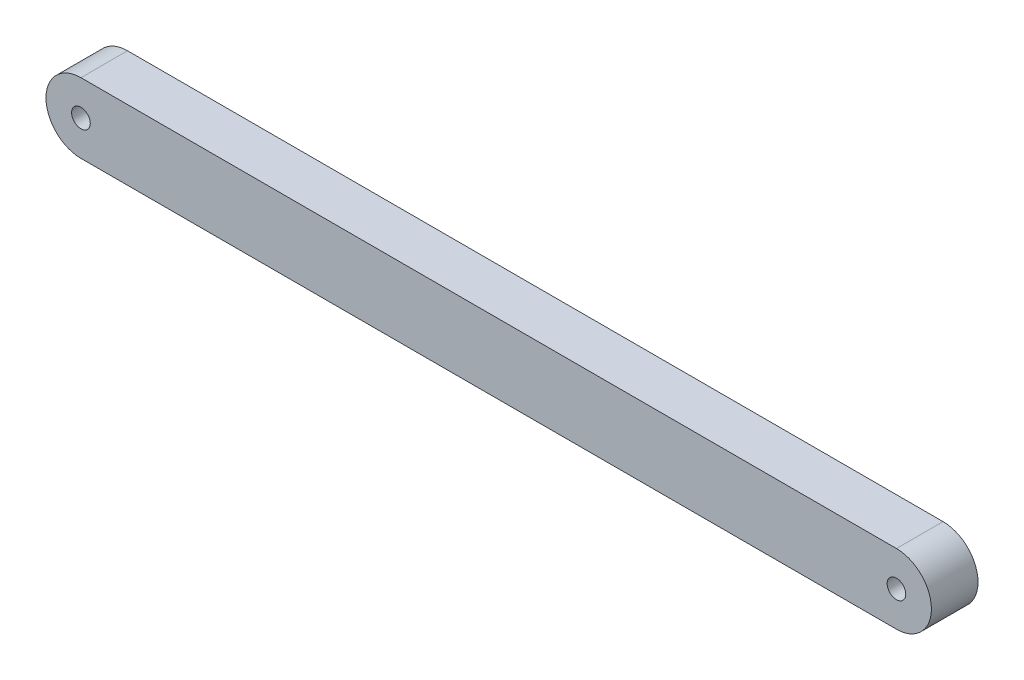
ISO-10303-21;
HEADER;
FILE_DESCRIPTION(('STEP AP214'),'2;1');
FILE_NAME('part.step','',(''),(''),'','','');
FILE_SCHEMA(('AUTOMOTIVE_DESIGN { 1 0 10303 214 1 1 1 1 }'));
ENDSEC;
DATA;
#1=APPLICATION_CONTEXT('core data for automotive mechanical design processes');
#2=APPLICATION_PROTOCOL_DEFINITION('international standard','automotive_design',2000,#1);
#3=PRODUCT_CONTEXT('',#1,'mechanical');
#4=PRODUCT('Part','Part','',(#3));
#5=PRODUCT_RELATED_PRODUCT_CATEGORY('part','',(#4));
#6=PRODUCT_DEFINITION_FORMATION('','',#4);
#7=PRODUCT_DEFINITION_CONTEXT('part definition',#1,'design');
#8=PRODUCT_DEFINITION('design','',#6,#7);
#9=PRODUCT_DEFINITION_SHAPE('','',#8);
#10=(LENGTH_UNIT() NAMED_UNIT(*) SI_UNIT(.MILLI.,.METRE.));
#11=(NAMED_UNIT(*) PLANE_ANGLE_UNIT() SI_UNIT($,.RADIAN.));
#12=(NAMED_UNIT(*) SI_UNIT($,.STERADIAN.) SOLID_ANGLE_UNIT());
#13=UNCERTAINTY_MEASURE_WITH_UNIT(LENGTH_MEASURE(1.E-05),#10,'distance_accuracy_value','');
#14=(GEOMETRIC_REPRESENTATION_CONTEXT(3) GLOBAL_UNCERTAINTY_ASSIGNED_CONTEXT((#13)) GLOBAL_UNIT_ASSIGNED_CONTEXT((#10,
#11,#12)) REPRESENTATION_CONTEXT('',''));
#15=CARTESIAN_POINT('',(0.,0.,0.));
#16=DIRECTION('',(0.,0.,1.));
#17=DIRECTION('',(1.,0.,0.));
#18=AXIS2_PLACEMENT_3D('',#15,#16,#17);
#19=CARTESIAN_POINT('',(0.,0.,20.));
#20=DIRECTION('',(0.,0.,-1.));
#21=DIRECTION('',(-1.,0.,0.));
#22=AXIS2_PLACEMENT_3D('',#19,#20,#21);
#23=CYLINDRICAL_SURFACE('',#22,15.);
#24=CARTESIAN_POINT('',(0.,0.,0.));
#25=DIRECTION('',(0.,0.,1.));
#26=DIRECTION('',(1.,0.,0.));
#27=AXIS2_PLACEMENT_3D('',#24,#25,#26);
#28=CIRCLE('',#27,15.);
#29=CARTESIAN_POINT('',(0.,15.,0.));
#30=VERTEX_POINT('',#29);
#31=CARTESIAN_POINT('',(0.,-15.,0.));
#32=VERTEX_POINT('',#31);
#33=EDGE_CURVE('E113',#30,#32,#28,.T.);
#34=ORIENTED_EDGE('',*,*,#33,.T.);
#35=DIRECTION('',(0.,0.,-1.));
#36=VECTOR('',#35,1.);
#37=CARTESIAN_POINT('',(0.,-15.,20.));
#38=LINE('',#37,#36);
#39=CARTESIAN_POINT('',(0.,-15.,20.));
#40=VERTEX_POINT('',#39);
#41=EDGE_CURVE('E11',#40,#32,#38,.T.);
#42=ORIENTED_EDGE('',*,*,#41,.F.);
#43=CARTESIAN_POINT('',(0.,0.,20.));
#44=DIRECTION('',(0.,0.,1.));
#45=DIRECTION('',(1.,0.,0.));
#46=AXIS2_PLACEMENT_3D('',#43,#44,#45);
#47=CIRCLE('',#46,15.);
#48=CARTESIAN_POINT('',(0.,15.,20.));
#49=VERTEX_POINT('',#48);
#50=EDGE_CURVE('E97',#49,#40,#47,.T.);
#51=ORIENTED_EDGE('',*,*,#50,.F.);
#52=DIRECTION('',(0.,0.,-1.));
#53=VECTOR('',#52,1.);
#54=CARTESIAN_POINT('',(0.,15.,20.));
#55=LINE('',#54,#53);
#56=EDGE_CURVE('E109',#49,#30,#55,.T.);
#57=ORIENTED_EDGE('',*,*,#56,.T.);
#58=EDGE_LOOP('',(#34,#42,#51,#57));
#59=FACE_BOUND('',#58,.T.);
#60=ADVANCED_FACE('F45',(#59),#23,.T.);
#61=CARTESIAN_POINT('',(0.,-15.,20.));
#62=DIRECTION('',(0.,1.,0.));
#63=DIRECTION('',(-1.,0.,0.));
#64=AXIS2_PLACEMENT_3D('',#61,#62,#63);
#65=PLANE('',#64);
#66=DIRECTION('',(1.,0.,0.));
#67=VECTOR('',#66,1.);
#68=CARTESIAN_POINT('',(0.,-15.,0.));
#69=LINE('',#68,#67);
#70=CARTESIAN_POINT('',(350.,-15.,0.));
#71=VERTEX_POINT('',#70);
#72=EDGE_CURVE('E102',#32,#71,#69,.T.);
#73=ORIENTED_EDGE('',*,*,#72,.T.);
#74=DIRECTION('',(0.,0.,-1.));
#75=VECTOR('',#74,1.);
#76=CARTESIAN_POINT('',(350.,-15.,20.));
#77=LINE('',#76,#75);
#78=CARTESIAN_POINT('',(350.,-15.,20.));
#79=VERTEX_POINT('',#78);
#80=EDGE_CURVE('E54',#79,#71,#77,.T.);
#81=ORIENTED_EDGE('',*,*,#80,.F.);
#82=DIRECTION('',(1.,0.,0.));
#83=VECTOR('',#82,1.);
#84=CARTESIAN_POINT('',(0.,-15.,20.));
#85=LINE('',#84,#83);
#86=EDGE_CURVE('E92',#40,#79,#85,.T.);
#87=ORIENTED_EDGE('',*,*,#86,.F.);
#88=ORIENTED_EDGE('',*,*,#41,.T.);
#89=EDGE_LOOP('',(#73,#81,#87,#88));
#90=FACE_BOUND('',#89,.T.);
#91=ADVANCED_FACE('F101',(#90),#65,.F.);
#92=CARTESIAN_POINT('',(350.,0.,20.));
#93=DIRECTION('',(0.,0.,-1.));
#94=DIRECTION('',(-1.,0.,0.));
#95=AXIS2_PLACEMENT_3D('',#92,#93,#94);
#96=CYLINDRICAL_SURFACE('',#95,15.);
#97=CARTESIAN_POINT('',(350.,0.,0.));
#98=DIRECTION('',(0.,0.,1.));
#99=DIRECTION('',(1.,0.,0.));
#100=AXIS2_PLACEMENT_3D('',#97,#98,#99);
#101=CIRCLE('',#100,15.);
#102=CARTESIAN_POINT('',(350.,15.,0.));
#103=VERTEX_POINT('',#102);
#104=EDGE_CURVE('E79',#71,#103,#101,.T.);
#105=ORIENTED_EDGE('',*,*,#104,.T.);
#106=DIRECTION('',(0.,0.,-1.));
#107=VECTOR('',#106,1.);
#108=CARTESIAN_POINT('',(350.,15.,20.));
#109=LINE('',#108,#107);
#110=CARTESIAN_POINT('',(350.,15.,20.));
#111=VERTEX_POINT('',#110);
#112=EDGE_CURVE('E104',#111,#103,#109,.T.);
#113=ORIENTED_EDGE('',*,*,#112,.F.);
#114=CARTESIAN_POINT('',(350.,0.,20.));
#115=DIRECTION('',(0.,0.,1.));
#116=DIRECTION('',(1.,0.,0.));
#117=AXIS2_PLACEMENT_3D('',#114,#115,#116);
#118=CIRCLE('',#117,15.);
#119=EDGE_CURVE('E95',#79,#111,#118,.T.);
#120=ORIENTED_EDGE('',*,*,#119,.F.);
#121=ORIENTED_EDGE('',*,*,#80,.T.);
#122=EDGE_LOOP('',(#105,#113,#120,#121));
#123=FACE_BOUND('',#122,.T.);
#124=ADVANCED_FACE('F105',(#123),#96,.T.);
#125=CARTESIAN_POINT('',(0.,15.,20.));
#126=DIRECTION('',(0.,-1.,0.));
#127=DIRECTION('',(1.,0.,0.));
#128=AXIS2_PLACEMENT_3D('',#125,#126,#127);
#129=PLANE('',#128);
#130=DIRECTION('',(-1.,0.,0.));
#131=VECTOR('',#130,1.);
#132=CARTESIAN_POINT('',(0.,15.,0.));
#133=LINE('',#132,#131);
#134=EDGE_CURVE('E85',#103,#30,#133,.T.);
#135=ORIENTED_EDGE('',*,*,#134,.T.);
#136=ORIENTED_EDGE('',*,*,#56,.F.);
#137=DIRECTION('',(-1.,0.,0.));
#138=VECTOR('',#137,1.);
#139=CARTESIAN_POINT('',(0.,15.,20.));
#140=LINE('',#139,#138);
#141=EDGE_CURVE('E62',#111,#49,#140,.T.);
#142=ORIENTED_EDGE('',*,*,#141,.F.);
#143=ORIENTED_EDGE('',*,*,#112,.T.);
#144=EDGE_LOOP('',(#135,#136,#142,#143));
#145=FACE_BOUND('',#144,.T.);
#146=ADVANCED_FACE('F127',(#145),#129,.F.);
#147=CARTESIAN_POINT('',(0.,0.,20.));
#148=DIRECTION('',(0.,0.,1.));
#149=DIRECTION('',(1.,0.,0.));
#150=AXIS2_PLACEMENT_3D('',#147,#148,#149);
#151=PLANE('',#150);
#152=CARTESIAN_POINT('',(0.,0.,20.));
#153=DIRECTION('',(0.,0.,1.));
#154=DIRECTION('',(1.,0.,0.));
#155=AXIS2_PLACEMENT_3D('',#152,#153,#154);
#156=CIRCLE('',#155,4.);
#157=CARTESIAN_POINT('',(4.,0.,20.));
#158=VERTEX_POINT('',#157);
#159=EDGE_CURVE('E117',#158,#158,#156,.T.);
#160=ORIENTED_EDGE('',*,*,#159,.F.);
#161=EDGE_LOOP('',(#160));
#162=FACE_BOUND('',#161,.T.);
#163=CARTESIAN_POINT('',(350.,0.,20.));
#164=DIRECTION('',(0.,0.,1.));
#165=DIRECTION('',(1.,0.,0.));
#166=AXIS2_PLACEMENT_3D('',#163,#164,#165);
#167=CIRCLE('',#166,3.99999999999999);
#168=CARTESIAN_POINT('',(354.,0.,20.));
#169=VERTEX_POINT('',#168);
#170=EDGE_CURVE('E134',#169,#169,#167,.T.);
#171=ORIENTED_EDGE('',*,*,#170,.F.);
#172=EDGE_LOOP('',(#171));
#173=FACE_BOUND('',#172,.T.);
#174=ORIENTED_EDGE('',*,*,#50,.T.);
#175=ORIENTED_EDGE('',*,*,#86,.T.);
#176=ORIENTED_EDGE('',*,*,#119,.T.);
#177=ORIENTED_EDGE('',*,*,#141,.T.);
#178=EDGE_LOOP('',(#174,#175,#176,#177));
#179=FACE_BOUND('',#178,.T.);
#180=ADVANCED_FACE('F93',(#162,#173,#179),#151,.T.);
#181=CARTESIAN_POINT('',(0.,0.,0.));
#182=DIRECTION('',(0.,0.,1.));
#183=DIRECTION('',(1.,0.,0.));
#184=AXIS2_PLACEMENT_3D('',#181,#182,#183);
#185=PLANE('',#184);
#186=CARTESIAN_POINT('',(0.,0.,0.));
#187=DIRECTION('',(0.,0.,1.));
#188=DIRECTION('',(1.,0.,0.));
#189=AXIS2_PLACEMENT_3D('',#186,#187,#188);
#190=CIRCLE('',#189,4.);
#191=CARTESIAN_POINT('',(4.,0.,0.));
#192=VERTEX_POINT('',#191);
#193=EDGE_CURVE('E142',#192,#192,#190,.T.);
#194=ORIENTED_EDGE('',*,*,#193,.T.);
#195=EDGE_LOOP('',(#194));
#196=FACE_BOUND('',#195,.T.);
#197=CARTESIAN_POINT('',(350.,0.,0.));
#198=DIRECTION('',(0.,0.,1.));
#199=DIRECTION('',(1.,0.,0.));
#200=AXIS2_PLACEMENT_3D('',#197,#198,#199);
#201=CIRCLE('',#200,3.99999999999999);
#202=CARTESIAN_POINT('',(354.,0.,0.));
#203=VERTEX_POINT('',#202);
#204=EDGE_CURVE('E138',#203,#203,#201,.T.);
#205=ORIENTED_EDGE('',*,*,#204,.T.);
#206=EDGE_LOOP('',(#205));
#207=FACE_BOUND('',#206,.T.);
#208=ORIENTED_EDGE('',*,*,#33,.F.);
#209=ORIENTED_EDGE('',*,*,#134,.F.);
#210=ORIENTED_EDGE('',*,*,#104,.F.);
#211=ORIENTED_EDGE('',*,*,#72,.F.);
#212=EDGE_LOOP('',(#208,#209,#210,#211));
#213=FACE_BOUND('',#212,.T.);
#214=ADVANCED_FACE('F130',(#196,#207,#213),#185,.F.);
#215=CARTESIAN_POINT('',(350.,0.,20.));
#216=DIRECTION('',(0.,0.,-1.));
#217=DIRECTION('',(-1.,0.,0.));
#218=AXIS2_PLACEMENT_3D('',#215,#216,#217);
#219=CYLINDRICAL_SURFACE('',#218,3.99999999999999);
#220=ORIENTED_EDGE('',*,*,#170,.T.);
#221=EDGE_LOOP('',(#220));
#222=FACE_BOUND('',#221,.T.);
#223=ORIENTED_EDGE('',*,*,#204,.F.);
#224=EDGE_LOOP('',(#223));
#225=FACE_BOUND('',#224,.T.);
#226=ADVANCED_FACE('F158',(#222,#225),#219,.F.);
#227=CARTESIAN_POINT('',(0.,0.,20.));
#228=DIRECTION('',(0.,0.,-1.));
#229=DIRECTION('',(-1.,0.,0.));
#230=AXIS2_PLACEMENT_3D('',#227,#228,#229);
#231=CYLINDRICAL_SURFACE('',#230,4.);
#232=ORIENTED_EDGE('',*,*,#159,.T.);
#233=EDGE_LOOP('',(#232));
#234=FACE_BOUND('',#233,.T.);
#235=ORIENTED_EDGE('',*,*,#193,.F.);
#236=EDGE_LOOP('',(#235));
#237=FACE_BOUND('',#236,.T.);
#238=ADVANCED_FACE('F150',(#234,#237),#231,.F.);
#239=CLOSED_SHELL('',(#60,#91,#124,#146,#180,#214,#226,#238));
#240=MANIFOLD_SOLID_BREP('B2',#239);
#241=ADVANCED_BREP_SHAPE_REPRESENTATION('',(#18,#240),#14);
#242=SHAPE_DEFINITION_REPRESENTATION(#9,#241);
ENDSEC;
END-ISO-10303-21;
